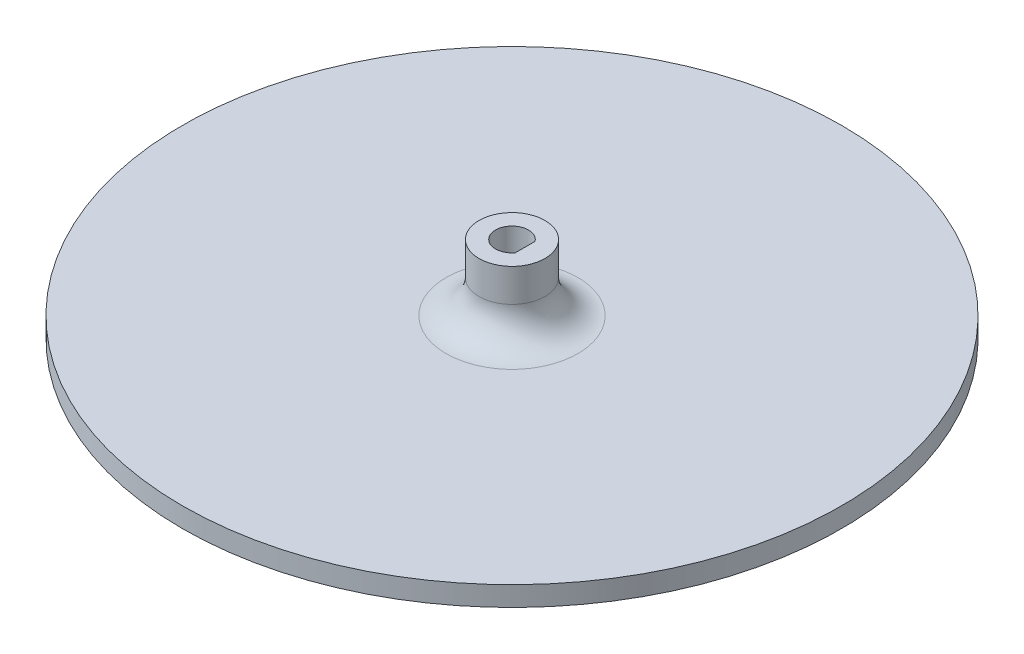
ISO-10303-21;
HEADER;
FILE_DESCRIPTION(('STEP AP214'),'2;1');
FILE_NAME('part.step','',(''),(''),'','','');
FILE_SCHEMA(('AUTOMOTIVE_DESIGN { 1 0 10303 214 1 1 1 1 }'));
ENDSEC;
DATA;
#1=APPLICATION_CONTEXT('core data for automotive mechanical design processes');
#2=APPLICATION_PROTOCOL_DEFINITION('international standard','automotive_design',2000,#1);
#3=PRODUCT_CONTEXT('',#1,'mechanical');
#4=PRODUCT('Part','Part','',(#3));
#5=PRODUCT_RELATED_PRODUCT_CATEGORY('part','',(#4));
#6=PRODUCT_DEFINITION_FORMATION('','',#4);
#7=PRODUCT_DEFINITION_CONTEXT('part definition',#1,'design');
#8=PRODUCT_DEFINITION('design','',#6,#7);
#9=PRODUCT_DEFINITION_SHAPE('','',#8);
#10=(LENGTH_UNIT() NAMED_UNIT(*) SI_UNIT(.MILLI.,.METRE.));
#11=(NAMED_UNIT(*) PLANE_ANGLE_UNIT() SI_UNIT($,.RADIAN.));
#12=(NAMED_UNIT(*) SI_UNIT($,.STERADIAN.) SOLID_ANGLE_UNIT());
#13=UNCERTAINTY_MEASURE_WITH_UNIT(LENGTH_MEASURE(1.E-05),#10,'distance_accuracy_value','');
#14=(GEOMETRIC_REPRESENTATION_CONTEXT(3) GLOBAL_UNCERTAINTY_ASSIGNED_CONTEXT((#13)) GLOBAL_UNIT_ASSIGNED_CONTEXT((#10,
#11,#12)) REPRESENTATION_CONTEXT('',''));
#15=CARTESIAN_POINT('',(0.,0.,0.));
#16=DIRECTION('',(0.,0.,1.));
#17=DIRECTION('',(1.,0.,0.));
#18=AXIS2_PLACEMENT_3D('',#15,#16,#17);
#19=CARTESIAN_POINT('',(0.,3.,0.));
#20=DIRECTION('',(0.,1.,0.));
#21=DIRECTION('',(0.,0.,1.));
#22=AXIS2_PLACEMENT_3D('',#19,#20,#21);
#23=PLANE('',#22);
#24=CARTESIAN_POINT('',(0.,3.,0.));
#25=DIRECTION('',(0.,1.,0.));
#26=DIRECTION('',(0.,0.,1.));
#27=AXIS2_PLACEMENT_3D('',#24,#25,#26);
#28=CIRCLE('',#27,10.);
#29=CARTESIAN_POINT('',(0.,3.,10.));
#30=VERTEX_POINT('',#29);
#31=EDGE_CURVE('E11',#30,#30,#28,.F.);
#32=ORIENTED_EDGE('',*,*,#31,.T.);
#33=EDGE_LOOP('',(#32));
#34=FACE_BOUND('',#33,.T.);
#35=CARTESIAN_POINT('',(0.,3.,0.));
#36=DIRECTION('',(0.,1.,0.));
#37=DIRECTION('',(0.,0.,1.));
#38=AXIS2_PLACEMENT_3D('',#35,#36,#37);
#39=CIRCLE('',#38,50.);
#40=CARTESIAN_POINT('',(0.,3.,50.));
#41=VERTEX_POINT('',#40);
#42=EDGE_CURVE('E79',#41,#41,#39,.T.);
#43=ORIENTED_EDGE('',*,*,#42,.T.);
#44=EDGE_LOOP('',(#43));
#45=FACE_BOUND('',#44,.T.);
#46=ADVANCED_FACE('F32',(#34,#45),#23,.T.);
#47=CARTESIAN_POINT('',(0.,3.,0.));
#48=DIRECTION('',(0.,-1.,0.));
#49=DIRECTION('',(0.,0.,-1.));
#50=AXIS2_PLACEMENT_3D('',#47,#48,#49);
#51=CYLINDRICAL_SURFACE('',#50,50.);
#52=ORIENTED_EDGE('',*,*,#42,.F.);
#53=EDGE_LOOP('',(#52));
#54=FACE_BOUND('',#53,.T.);
#55=CARTESIAN_POINT('',(0.,0.,0.));
#56=DIRECTION('',(0.,1.,0.));
#57=DIRECTION('',(0.,0.,1.));
#58=AXIS2_PLACEMENT_3D('',#55,#56,#57);
#59=CIRCLE('',#58,50.);
#60=CARTESIAN_POINT('',(0.,0.,50.));
#61=VERTEX_POINT('',#60);
#62=EDGE_CURVE('E74',#61,#61,#59,.T.);
#63=ORIENTED_EDGE('',*,*,#62,.T.);
#64=EDGE_LOOP('',(#63));
#65=FACE_BOUND('',#64,.T.);
#66=ADVANCED_FACE('F97',(#54,#65),#51,.T.);
#67=CARTESIAN_POINT('',(0.,0.,0.));
#68=DIRECTION('',(0.,1.,0.));
#69=DIRECTION('',(0.,0.,1.));
#70=AXIS2_PLACEMENT_3D('',#67,#68,#69);
#71=PLANE('',#70);
#72=ORIENTED_EDGE('',*,*,#62,.F.);
#73=EDGE_LOOP('',(#72));
#74=FACE_BOUND('',#73,.T.);
#75=ADVANCED_FACE('F102',(#74),#71,.F.);
#76=CARTESIAN_POINT('',(0.,13.,0.));
#77=DIRECTION('',(0.,1.,0.));
#78=DIRECTION('',(0.,0.,1.));
#79=AXIS2_PLACEMENT_3D('',#76,#77,#78);
#80=PLANE('',#79);
#81=CARTESIAN_POINT('',(0.,13.,0.));
#82=DIRECTION('',(0.,1.,0.));
#83=DIRECTION('',(0.,0.,1.));
#84=AXIS2_PLACEMENT_3D('',#81,#82,#83);
#85=CIRCLE('',#84,5.);
#86=CARTESIAN_POINT('',(0.,13.,5.));
#87=VERTEX_POINT('',#86);
#88=EDGE_CURVE('E71',#87,#87,#85,.T.);
#89=ORIENTED_EDGE('',*,*,#88,.T.);
#90=EDGE_LOOP('',(#89));
#91=FACE_BOUND('',#90,.T.);
#92=DIRECTION('',(0.,0.,-1.));
#93=VECTOR('',#92,1.);
#94=CARTESIAN_POINT('',(2.,13.,-1.5));
#95=LINE('',#94,#93);
#96=CARTESIAN_POINT('',(2.,13.,1.5));
#97=VERTEX_POINT('',#96);
#98=CARTESIAN_POINT('',(2.,13.,-1.5));
#99=VERTEX_POINT('',#98);
#100=EDGE_CURVE('E76',#97,#99,#95,.T.);
#101=ORIENTED_EDGE('',*,*,#100,.F.);
#102=CARTESIAN_POINT('',(0.,13.,0.));
#103=DIRECTION('',(0.,1.,0.));
#104=DIRECTION('',(0.,0.,1.));
#105=AXIS2_PLACEMENT_3D('',#102,#103,#104);
#106=CIRCLE('',#105,2.5);
#107=EDGE_CURVE('E66',#99,#97,#106,.T.);
#108=ORIENTED_EDGE('',*,*,#107,.F.);
#109=EDGE_LOOP('',(#101,#108));
#110=FACE_BOUND('',#109,.T.);
#111=ADVANCED_FACE('F109',(#91,#110),#80,.T.);
#112=CARTESIAN_POINT('',(0.,13.,0.));
#113=DIRECTION('',(0.,-1.,0.));
#114=DIRECTION('',(0.,0.,-1.));
#115=AXIS2_PLACEMENT_3D('',#112,#113,#114);
#116=CYLINDRICAL_SURFACE('',#115,5.);
#117=CARTESIAN_POINT('',(0.,8.,0.));
#118=DIRECTION('',(0.,1.,0.));
#119=DIRECTION('',(0.,0.,1.));
#120=AXIS2_PLACEMENT_3D('',#117,#118,#119);
#121=CIRCLE('',#120,5.);
#122=CARTESIAN_POINT('',(0.,8.,5.));
#123=VERTEX_POINT('',#122);
#124=EDGE_CURVE('E40',#123,#123,#121,.T.);
#125=ORIENTED_EDGE('',*,*,#124,.T.);
#126=EDGE_LOOP('',(#125));
#127=FACE_BOUND('',#126,.T.);
#128=ORIENTED_EDGE('',*,*,#88,.F.);
#129=EDGE_LOOP('',(#128));
#130=FACE_BOUND('',#129,.T.);
#131=ADVANCED_FACE('F86',(#127,#130),#116,.T.);
#132=CARTESIAN_POINT('',(0.,13.,0.));
#133=DIRECTION('',(0.,-1.,0.));
#134=DIRECTION('',(0.,0.,-1.));
#135=AXIS2_PLACEMENT_3D('',#132,#133,#134);
#136=CYLINDRICAL_SURFACE('',#135,2.5);
#137=CARTESIAN_POINT('',(0.,3.,0.));
#138=DIRECTION('',(0.,1.,0.));
#139=DIRECTION('',(0.,0.,1.));
#140=AXIS2_PLACEMENT_3D('',#137,#138,#139);
#141=CIRCLE('',#140,2.5);
#142=CARTESIAN_POINT('',(2.,3.,-1.5));
#143=VERTEX_POINT('',#142);
#144=CARTESIAN_POINT('',(2.,3.,1.5));
#145=VERTEX_POINT('',#144);
#146=EDGE_CURVE('E58',#143,#145,#141,.T.);
#147=ORIENTED_EDGE('',*,*,#146,.F.);
#148=DIRECTION('',(0.,-1.,0.));
#149=VECTOR('',#148,1.);
#150=CARTESIAN_POINT('',(2.,13.,-1.5));
#151=LINE('',#150,#149);
#152=EDGE_CURVE('E65',#99,#143,#151,.T.);
#153=ORIENTED_EDGE('',*,*,#152,.F.);
#154=ORIENTED_EDGE('',*,*,#107,.T.);
#155=DIRECTION('',(0.,-1.,0.));
#156=VECTOR('',#155,1.);
#157=CARTESIAN_POINT('',(2.,13.,1.5));
#158=LINE('',#157,#156);
#159=EDGE_CURVE('E53',#97,#145,#158,.T.);
#160=ORIENTED_EDGE('',*,*,#159,.T.);
#161=EDGE_LOOP('',(#147,#153,#154,#160));
#162=FACE_BOUND('',#161,.T.);
#163=ADVANCED_FACE('F68',(#162),#136,.F.);
#164=CARTESIAN_POINT('',(2.,13.,-1.5));
#165=DIRECTION('',(-1.,0.,0.));
#166=DIRECTION('',(0.,0.,1.));
#167=AXIS2_PLACEMENT_3D('',#164,#165,#166);
#168=PLANE('',#167);
#169=DIRECTION('',(0.,0.,-1.));
#170=VECTOR('',#169,1.);
#171=CARTESIAN_POINT('',(2.,3.,-1.5));
#172=LINE('',#171,#170);
#173=EDGE_CURVE('E46',#145,#143,#172,.T.);
#174=ORIENTED_EDGE('',*,*,#173,.F.);
#175=ORIENTED_EDGE('',*,*,#159,.F.);
#176=ORIENTED_EDGE('',*,*,#100,.T.);
#177=ORIENTED_EDGE('',*,*,#152,.T.);
#178=EDGE_LOOP('',(#174,#175,#176,#177));
#179=FACE_BOUND('',#178,.T.);
#180=ADVANCED_FACE('F64',(#179),#168,.T.);
#181=ORIENTED_EDGE('',*,*,#146,.T.);
#182=ORIENTED_EDGE('',*,*,#173,.T.);
#183=EDGE_LOOP('',(#181,#182));
#184=FACE_BOUND('',#183,.T.);
#185=ADVANCED_FACE('F59',(#184),#23,.T.);
#186=CARTESIAN_POINT('',(0.,8.,0.));
#187=DIRECTION('',(0.,1.,0.));
#188=DIRECTION('',(0.,0.,1.));
#189=AXIS2_PLACEMENT_3D('',#186,#187,#188);
#190=TOROIDAL_SURFACE('',#189,10.,5.);
#191=ORIENTED_EDGE('',*,*,#31,.F.);
#192=EDGE_LOOP('',(#191));
#193=FACE_BOUND('',#192,.T.);
#194=ORIENTED_EDGE('',*,*,#124,.F.);
#195=EDGE_LOOP('',(#194));
#196=FACE_BOUND('',#195,.T.);
#197=ADVANCED_FACE('F34',(#193,#196),#190,.F.);
#198=CLOSED_SHELL('',(#46,#66,#75,#111,#131,#163,#180,#185,#197));
#199=MANIFOLD_SOLID_BREP('B2',#198);
#200=ADVANCED_BREP_SHAPE_REPRESENTATION('',(#18,#199),#14);
#201=SHAPE_DEFINITION_REPRESENTATION(#9,#200);
ENDSEC;
END-ISO-10303-21;
